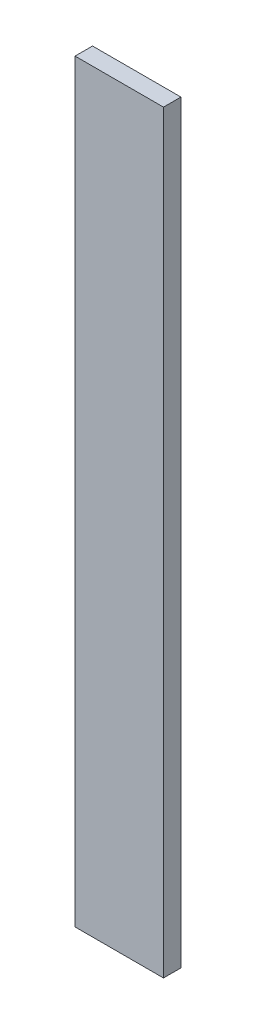
ISO-10303-21;
HEADER;
FILE_DESCRIPTION(('STEP AP214'),'2;1');
FILE_NAME('part.step','',(''),(''),'','','');
FILE_SCHEMA(('AUTOMOTIVE_DESIGN { 1 0 10303 214 1 1 1 1 }'));
ENDSEC;
DATA;
#1=APPLICATION_CONTEXT('core data for automotive mechanical design processes');
#2=APPLICATION_PROTOCOL_DEFINITION('international standard','automotive_design',2000,#1);
#3=PRODUCT_CONTEXT('',#1,'mechanical');
#4=PRODUCT('Part','Part','',(#3));
#5=PRODUCT_RELATED_PRODUCT_CATEGORY('part','',(#4));
#6=PRODUCT_DEFINITION_FORMATION('','',#4);
#7=PRODUCT_DEFINITION_CONTEXT('part definition',#1,'design');
#8=PRODUCT_DEFINITION('design','',#6,#7);
#9=PRODUCT_DEFINITION_SHAPE('','',#8);
#10=(LENGTH_UNIT() NAMED_UNIT(*) SI_UNIT(.MILLI.,.METRE.));
#11=(NAMED_UNIT(*) PLANE_ANGLE_UNIT() SI_UNIT($,.RADIAN.));
#12=(NAMED_UNIT(*) SI_UNIT($,.STERADIAN.) SOLID_ANGLE_UNIT());
#13=UNCERTAINTY_MEASURE_WITH_UNIT(LENGTH_MEASURE(1.E-05),#10,'distance_accuracy_value','');
#14=(GEOMETRIC_REPRESENTATION_CONTEXT(3) GLOBAL_UNCERTAINTY_ASSIGNED_CONTEXT((#13)) GLOBAL_UNIT_ASSIGNED_CONTEXT((#10,
#11,#12)) REPRESENTATION_CONTEXT('',''));
#15=CARTESIAN_POINT('',(0.,0.,0.));
#16=DIRECTION('',(0.,0.,1.));
#17=DIRECTION('',(1.,0.,0.));
#18=AXIS2_PLACEMENT_3D('',#15,#16,#17);
#19=CARTESIAN_POINT('',(1828.04951030859,2770.35107747861,19.05));
#20=DIRECTION('',(0.,-1.,0.));
#21=DIRECTION('',(0.,0.,-1.));
#22=AXIS2_PLACEMENT_3D('',#19,#20,#21);
#23=PLANE('',#22);
#24=DIRECTION('',(-1.,0.,0.));
#25=VECTOR('',#24,1.);
#26=CARTESIAN_POINT('',(1828.04951030859,2770.35107747861,0.));
#27=LINE('',#26,#25);
#28=CARTESIAN_POINT('',(1828.04951030859,2770.35107747861,0.));
#29=VERTEX_POINT('',#28);
#30=CARTESIAN_POINT('',(1731.52951030859,2770.35107747861,0.));
#31=VERTEX_POINT('',#30);
#32=EDGE_CURVE('E96',#29,#31,#27,.T.);
#33=ORIENTED_EDGE('',*,*,#32,.T.);
#34=DIRECTION('',(0.,0.,-1.));
#35=VECTOR('',#34,1.);
#36=CARTESIAN_POINT('',(1731.52951030859,2770.35107747861,19.05));
#37=LINE('',#36,#35);
#38=CARTESIAN_POINT('',(1731.52951030859,2770.35107747861,19.05));
#39=VERTEX_POINT('',#38);
#40=EDGE_CURVE('E11',#39,#31,#37,.T.);
#41=ORIENTED_EDGE('',*,*,#40,.F.);
#42=DIRECTION('',(-1.,0.,0.));
#43=VECTOR('',#42,1.);
#44=CARTESIAN_POINT('',(1828.04951030859,2770.35107747861,19.05));
#45=LINE('',#44,#43);
#46=CARTESIAN_POINT('',(1828.04951030859,2770.35107747861,19.05));
#47=VERTEX_POINT('',#46);
#48=EDGE_CURVE('E84',#47,#39,#45,.T.);
#49=ORIENTED_EDGE('',*,*,#48,.F.);
#50=DIRECTION('',(0.,0.,-1.));
#51=VECTOR('',#50,1.);
#52=CARTESIAN_POINT('',(1828.04951030859,2770.35107747861,19.05));
#53=LINE('',#52,#51);
#54=EDGE_CURVE('E92',#47,#29,#53,.T.);
#55=ORIENTED_EDGE('',*,*,#54,.T.);
#56=EDGE_LOOP('',(#33,#41,#49,#55));
#57=FACE_BOUND('',#56,.T.);
#58=ADVANCED_FACE('F33',(#57),#23,.F.);
#59=CARTESIAN_POINT('',(1731.52951030859,2770.35107747861,19.05));
#60=DIRECTION('',(1.,0.,0.));
#61=DIRECTION('',(0.,0.,-1.));
#62=AXIS2_PLACEMENT_3D('',#59,#60,#61);
#63=PLANE('',#62);
#64=DIRECTION('',(0.,-1.,0.));
#65=VECTOR('',#64,1.);
#66=CARTESIAN_POINT('',(1731.52951030859,2770.35107747861,0.));
#67=LINE('',#66,#65);
#68=CARTESIAN_POINT('',(1731.52951030859,1946.98467747861,0.));
#69=VERTEX_POINT('',#68);
#70=EDGE_CURVE('E88',#31,#69,#67,.T.);
#71=ORIENTED_EDGE('',*,*,#70,.T.);
#72=DIRECTION('',(0.,0.,-1.));
#73=VECTOR('',#72,1.);
#74=CARTESIAN_POINT('',(1731.52951030859,1946.98467747861,19.05));
#75=LINE('',#74,#73);
#76=CARTESIAN_POINT('',(1731.52951030859,1946.98467747861,19.05));
#77=VERTEX_POINT('',#76);
#78=EDGE_CURVE('E41',#77,#69,#75,.T.);
#79=ORIENTED_EDGE('',*,*,#78,.F.);
#80=DIRECTION('',(0.,-1.,0.));
#81=VECTOR('',#80,1.);
#82=CARTESIAN_POINT('',(1731.52951030859,2770.35107747861,19.05));
#83=LINE('',#82,#81);
#84=EDGE_CURVE('E79',#39,#77,#83,.T.);
#85=ORIENTED_EDGE('',*,*,#84,.F.);
#86=ORIENTED_EDGE('',*,*,#40,.T.);
#87=EDGE_LOOP('',(#71,#79,#85,#86));
#88=FACE_BOUND('',#87,.T.);
#89=ADVANCED_FACE('F87',(#88),#63,.F.);
#90=CARTESIAN_POINT('',(1731.52951030859,1946.98467747861,19.05));
#91=DIRECTION('',(0.,1.,0.));
#92=DIRECTION('',(0.,0.,1.));
#93=AXIS2_PLACEMENT_3D('',#90,#91,#92);
#94=PLANE('',#93);
#95=DIRECTION('',(1.,0.,0.));
#96=VECTOR('',#95,1.);
#97=CARTESIAN_POINT('',(1731.52951030859,1946.98467747861,0.));
#98=LINE('',#97,#96);
#99=CARTESIAN_POINT('',(1828.04951030859,1946.98467747861,0.));
#100=VERTEX_POINT('',#99);
#101=EDGE_CURVE('E66',#69,#100,#98,.T.);
#102=ORIENTED_EDGE('',*,*,#101,.T.);
#103=DIRECTION('',(0.,0.,-1.));
#104=VECTOR('',#103,1.);
#105=CARTESIAN_POINT('',(1828.04951030859,1946.98467747861,19.05));
#106=LINE('',#105,#104);
#107=CARTESIAN_POINT('',(1828.04951030859,1946.98467747861,19.05));
#108=VERTEX_POINT('',#107);
#109=EDGE_CURVE('E89',#108,#100,#106,.T.);
#110=ORIENTED_EDGE('',*,*,#109,.F.);
#111=DIRECTION('',(1.,0.,0.));
#112=VECTOR('',#111,1.);
#113=CARTESIAN_POINT('',(1731.52951030859,1946.98467747861,19.05));
#114=LINE('',#113,#112);
#115=EDGE_CURVE('E82',#77,#108,#114,.T.);
#116=ORIENTED_EDGE('',*,*,#115,.F.);
#117=ORIENTED_EDGE('',*,*,#78,.T.);
#118=EDGE_LOOP('',(#102,#110,#116,#117));
#119=FACE_BOUND('',#118,.T.);
#120=ADVANCED_FACE('F90',(#119),#94,.F.);
#121=CARTESIAN_POINT('',(1828.04951030859,1946.98467747861,19.05));
#122=DIRECTION('',(-1.,0.,0.));
#123=DIRECTION('',(0.,0.,1.));
#124=AXIS2_PLACEMENT_3D('',#121,#122,#123);
#125=PLANE('',#124);
#126=DIRECTION('',(0.,1.,0.));
#127=VECTOR('',#126,1.);
#128=CARTESIAN_POINT('',(1828.04951030859,1946.98467747861,0.));
#129=LINE('',#128,#127);
#130=EDGE_CURVE('E72',#100,#29,#129,.T.);
#131=ORIENTED_EDGE('',*,*,#130,.T.);
#132=ORIENTED_EDGE('',*,*,#54,.F.);
#133=DIRECTION('',(0.,1.,0.));
#134=VECTOR('',#133,1.);
#135=CARTESIAN_POINT('',(1828.04951030859,1946.98467747861,19.05));
#136=LINE('',#135,#134);
#137=EDGE_CURVE('E49',#108,#47,#136,.T.);
#138=ORIENTED_EDGE('',*,*,#137,.F.);
#139=ORIENTED_EDGE('',*,*,#109,.T.);
#140=EDGE_LOOP('',(#131,#132,#138,#139));
#141=FACE_BOUND('',#140,.T.);
#142=ADVANCED_FACE('F103',(#141),#125,.F.);
#143=CARTESIAN_POINT('',(0.,0.,19.05));
#144=DIRECTION('',(0.,0.,1.));
#145=DIRECTION('',(1.,0.,0.));
#146=AXIS2_PLACEMENT_3D('',#143,#144,#145);
#147=PLANE('',#146);
#148=ORIENTED_EDGE('',*,*,#48,.T.);
#149=ORIENTED_EDGE('',*,*,#84,.T.);
#150=ORIENTED_EDGE('',*,*,#115,.T.);
#151=ORIENTED_EDGE('',*,*,#137,.T.);
#152=EDGE_LOOP('',(#148,#149,#150,#151));
#153=FACE_BOUND('',#152,.T.);
#154=ADVANCED_FACE('F80',(#153),#147,.T.);
#155=CARTESIAN_POINT('',(0.,0.,0.));
#156=DIRECTION('',(0.,0.,1.));
#157=DIRECTION('',(1.,0.,0.));
#158=AXIS2_PLACEMENT_3D('',#155,#156,#157);
#159=PLANE('',#158);
#160=ORIENTED_EDGE('',*,*,#32,.F.);
#161=ORIENTED_EDGE('',*,*,#130,.F.);
#162=ORIENTED_EDGE('',*,*,#101,.F.);
#163=ORIENTED_EDGE('',*,*,#70,.F.);
#164=EDGE_LOOP('',(#160,#161,#162,#163));
#165=FACE_BOUND('',#164,.T.);
#166=ADVANCED_FACE('F106',(#165),#159,.F.);
#167=CLOSED_SHELL('',(#58,#89,#120,#142,#154,#166));
#168=MANIFOLD_SOLID_BREP('B2',#167);
#169=ADVANCED_BREP_SHAPE_REPRESENTATION('',(#18,#168),#14);
#170=SHAPE_DEFINITION_REPRESENTATION(#9,#169);
ENDSEC;
END-ISO-10303-21;
